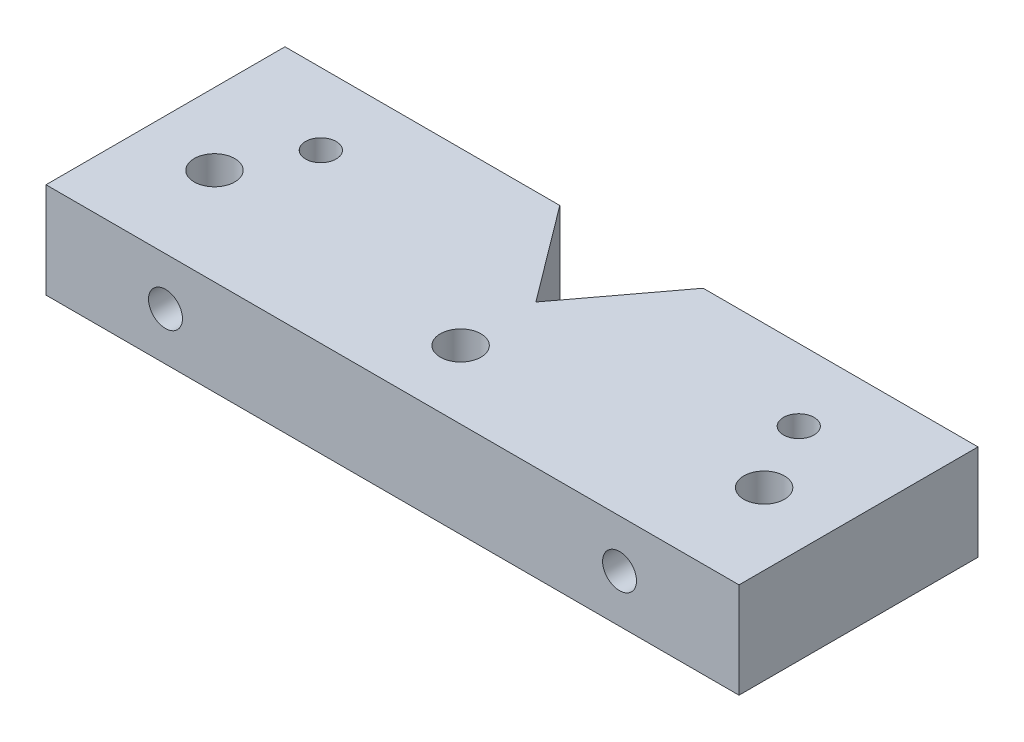
ISO-10303-21;
HEADER;
FILE_DESCRIPTION(('STEP AP214'),'2;1');
FILE_NAME('part.step','',(''),(''),'','','');
FILE_SCHEMA(('AUTOMOTIVE_DESIGN { 1 0 10303 214 1 1 1 1 }'));
ENDSEC;
DATA;
#1=APPLICATION_CONTEXT('core data for automotive mechanical design processes');
#2=APPLICATION_PROTOCOL_DEFINITION('international standard','automotive_design',2000,#1);
#3=PRODUCT_CONTEXT('',#1,'mechanical');
#4=PRODUCT('Part','Part','',(#3));
#5=PRODUCT_RELATED_PRODUCT_CATEGORY('part','',(#4));
#6=PRODUCT_DEFINITION_FORMATION('','',#4);
#7=PRODUCT_DEFINITION_CONTEXT('part definition',#1,'design');
#8=PRODUCT_DEFINITION('design','',#6,#7);
#9=PRODUCT_DEFINITION_SHAPE('','',#8);
#10=(LENGTH_UNIT() NAMED_UNIT(*) SI_UNIT(.MILLI.,.METRE.));
#11=(NAMED_UNIT(*) PLANE_ANGLE_UNIT() SI_UNIT($,.RADIAN.));
#12=(NAMED_UNIT(*) SI_UNIT($,.STERADIAN.) SOLID_ANGLE_UNIT());
#13=UNCERTAINTY_MEASURE_WITH_UNIT(LENGTH_MEASURE(1.E-05),#10,'distance_accuracy_value','');
#14=(GEOMETRIC_REPRESENTATION_CONTEXT(3) GLOBAL_UNCERTAINTY_ASSIGNED_CONTEXT((#13)) GLOBAL_UNIT_ASSIGNED_CONTEXT((#10,
#11,#12)) REPRESENTATION_CONTEXT('',''));
#15=CARTESIAN_POINT('',(0.,0.,0.));
#16=DIRECTION('',(0.,0.,1.));
#17=DIRECTION('',(1.,0.,0.));
#18=AXIS2_PLACEMENT_3D('',#15,#16,#17);
#19=CARTESIAN_POINT('',(0.,20.,0.));
#20=DIRECTION('',(0.,-1.,0.));
#21=DIRECTION('',(0.,0.,-1.));
#22=AXIS2_PLACEMENT_3D('',#19,#20,#21);
#23=PLANE('',#22);
#24=CARTESIAN_POINT('',(22.5,20.,-35.));
#25=DIRECTION('',(0.,1.,0.));
#26=DIRECTION('',(0.,0.,1.));
#27=AXIS2_PLACEMENT_3D('',#24,#25,#26);
#28=CIRCLE('',#27,3.2);
#29=CARTESIAN_POINT('',(22.5,20.,-31.8));
#30=VERTEX_POINT('',#29);
#31=EDGE_CURVE('E198',#30,#30,#28,.T.);
#32=ORIENTED_EDGE('',*,*,#31,.F.);
#33=EDGE_LOOP('',(#32));
#34=FACE_BOUND('',#33,.T.);
#35=CARTESIAN_POINT('',(122.5,20.,-35.));
#36=DIRECTION('',(0.,1.,0.));
#37=DIRECTION('',(0.,0.,1.));
#38=AXIS2_PLACEMENT_3D('',#35,#36,#37);
#39=CIRCLE('',#38,3.20000000000001);
#40=CARTESIAN_POINT('',(122.5,20.,-31.8));
#41=VERTEX_POINT('',#40);
#42=EDGE_CURVE('E192',#41,#41,#39,.T.);
#43=ORIENTED_EDGE('',*,*,#42,.F.);
#44=EDGE_LOOP('',(#43));
#45=FACE_BOUND('',#44,.T.);
#46=DIRECTION('',(1.,0.,0.));
#47=VECTOR('',#46,1.);
#48=CARTESIAN_POINT('',(145.,20.,0.));
#49=LINE('',#48,#47);
#50=CARTESIAN_POINT('',(0.,20.,0.));
#51=VERTEX_POINT('',#50);
#52=CARTESIAN_POINT('',(145.,20.,0.));
#53=VERTEX_POINT('',#52);
#54=EDGE_CURVE('E138',#51,#53,#49,.T.);
#55=ORIENTED_EDGE('',*,*,#54,.T.);
#56=DIRECTION('',(0.,0.,-1.));
#57=VECTOR('',#56,1.);
#58=CARTESIAN_POINT('',(145.,20.,-50.));
#59=LINE('',#58,#57);
#60=CARTESIAN_POINT('',(145.,20.,-50.));
#61=VERTEX_POINT('',#60);
#62=EDGE_CURVE('E91',#53,#61,#59,.T.);
#63=ORIENTED_EDGE('',*,*,#62,.T.);
#64=DIRECTION('',(-1.,0.,0.));
#65=VECTOR('',#64,1.);
#66=CARTESIAN_POINT('',(87.5,20.,-50.));
#67=LINE('',#66,#65);
#68=CARTESIAN_POINT('',(87.5,20.,-50.));
#69=VERTEX_POINT('',#68);
#70=EDGE_CURVE('E150',#61,#69,#67,.T.);
#71=ORIENTED_EDGE('',*,*,#70,.T.);
#72=DIRECTION('',(-0.6,0.,0.8));
#73=VECTOR('',#72,1.);
#74=CARTESIAN_POINT('',(72.5,20.,-30.));
#75=LINE('',#74,#73);
#76=CARTESIAN_POINT('',(72.5,20.,-30.));
#77=VERTEX_POINT('',#76);
#78=EDGE_CURVE('E107',#69,#77,#75,.T.);
#79=ORIENTED_EDGE('',*,*,#78,.T.);
#80=DIRECTION('',(-0.6,0.,-0.8));
#81=VECTOR('',#80,1.);
#82=CARTESIAN_POINT('',(57.5,20.,-50.));
#83=LINE('',#82,#81);
#84=CARTESIAN_POINT('',(57.5,20.,-50.));
#85=VERTEX_POINT('',#84);
#86=EDGE_CURVE('E101',#77,#85,#83,.T.);
#87=ORIENTED_EDGE('',*,*,#86,.T.);
#88=DIRECTION('',(-1.,0.,0.));
#89=VECTOR('',#88,1.);
#90=CARTESIAN_POINT('',(0.,20.,-50.));
#91=LINE('',#90,#89);
#92=CARTESIAN_POINT('',(0.,20.,-50.));
#93=VERTEX_POINT('',#92);
#94=EDGE_CURVE('E105',#85,#93,#91,.T.);
#95=ORIENTED_EDGE('',*,*,#94,.T.);
#96=DIRECTION('',(0.,0.,1.));
#97=VECTOR('',#96,1.);
#98=CARTESIAN_POINT('',(0.,20.,0.));
#99=LINE('',#98,#97);
#100=EDGE_CURVE('E51',#93,#51,#99,.T.);
#101=ORIENTED_EDGE('',*,*,#100,.T.);
#102=EDGE_LOOP('',(#55,#63,#71,#79,#87,#95,#101));
#103=FACE_BOUND('',#102,.T.);
#104=CARTESIAN_POINT('',(15.,20.,-20.25));
#105=DIRECTION('',(0.,1.,0.));
#106=DIRECTION('',(0.,0.,1.));
#107=AXIS2_PLACEMENT_3D('',#104,#105,#106);
#108=CIRCLE('',#107,4.25);
#109=CARTESIAN_POINT('',(15.,20.,-16.));
#110=VERTEX_POINT('',#109);
#111=EDGE_CURVE('E129',#110,#110,#108,.T.);
#112=ORIENTED_EDGE('',*,*,#111,.F.);
#113=EDGE_LOOP('',(#112));
#114=FACE_BOUND('',#113,.T.);
#115=CARTESIAN_POINT('',(72.5,20.,-14.25));
#116=DIRECTION('',(0.,1.,0.));
#117=DIRECTION('',(0.,0.,1.));
#118=AXIS2_PLACEMENT_3D('',#115,#116,#117);
#119=CIRCLE('',#118,4.25000000000001);
#120=CARTESIAN_POINT('',(72.5,20.,-9.99999999999998));
#121=VERTEX_POINT('',#120);
#122=EDGE_CURVE('E165',#121,#121,#119,.T.);
#123=ORIENTED_EDGE('',*,*,#122,.F.);
#124=EDGE_LOOP('',(#123));
#125=FACE_BOUND('',#124,.T.);
#126=CARTESIAN_POINT('',(130.,20.,-20.25));
#127=DIRECTION('',(0.,1.,0.));
#128=DIRECTION('',(0.,0.,1.));
#129=AXIS2_PLACEMENT_3D('',#126,#127,#128);
#130=CIRCLE('',#129,4.25);
#131=CARTESIAN_POINT('',(130.,20.,-16.));
#132=VERTEX_POINT('',#131);
#133=EDGE_CURVE('E171',#132,#132,#130,.T.);
#134=ORIENTED_EDGE('',*,*,#133,.F.);
#135=EDGE_LOOP('',(#134));
#136=FACE_BOUND('',#135,.T.);
#137=ADVANCED_FACE('F34',(#34,#45,#103,#114,#125,#136),#23,.F.);
#138=CARTESIAN_POINT('',(0.,0.,0.));
#139=DIRECTION('',(0.,-1.,0.));
#140=DIRECTION('',(0.,0.,-1.));
#141=AXIS2_PLACEMENT_3D('',#138,#139,#140);
#142=PLANE('',#141);
#143=CARTESIAN_POINT('',(72.5,0.,-14.25));
#144=DIRECTION('',(0.,1.,0.));
#145=DIRECTION('',(0.,0.,1.));
#146=AXIS2_PLACEMENT_3D('',#143,#144,#145);
#147=CIRCLE('',#146,4.25000000000001);
#148=CARTESIAN_POINT('',(72.5,0.,-9.99999999999998));
#149=VERTEX_POINT('',#148);
#150=EDGE_CURVE('E168',#149,#149,#147,.T.);
#151=ORIENTED_EDGE('',*,*,#150,.T.);
#152=EDGE_LOOP('',(#151));
#153=FACE_BOUND('',#152,.T.);
#154=DIRECTION('',(1.,0.,0.));
#155=VECTOR('',#154,1.);
#156=CARTESIAN_POINT('',(145.,0.,0.));
#157=LINE('',#156,#155);
#158=CARTESIAN_POINT('',(0.,0.,0.));
#159=VERTEX_POINT('',#158);
#160=CARTESIAN_POINT('',(145.,0.,0.));
#161=VERTEX_POINT('',#160);
#162=EDGE_CURVE('E125',#159,#161,#157,.T.);
#163=ORIENTED_EDGE('',*,*,#162,.F.);
#164=DIRECTION('',(0.,0.,1.));
#165=VECTOR('',#164,1.);
#166=CARTESIAN_POINT('',(0.,0.,0.));
#167=LINE('',#166,#165);
#168=CARTESIAN_POINT('',(0.,0.,-50.));
#169=VERTEX_POINT('',#168);
#170=EDGE_CURVE('E83',#169,#159,#167,.T.);
#171=ORIENTED_EDGE('',*,*,#170,.F.);
#172=DIRECTION('',(-1.,0.,0.));
#173=VECTOR('',#172,1.);
#174=CARTESIAN_POINT('',(0.,0.,-50.));
#175=LINE('',#174,#173);
#176=CARTESIAN_POINT('',(57.5,0.,-50.));
#177=VERTEX_POINT('',#176);
#178=EDGE_CURVE('E77',#177,#169,#175,.T.);
#179=ORIENTED_EDGE('',*,*,#178,.F.);
#180=DIRECTION('',(-0.6,0.,-0.8));
#181=VECTOR('',#180,1.);
#182=CARTESIAN_POINT('',(57.5,0.,-50.));
#183=LINE('',#182,#181);
#184=CARTESIAN_POINT('',(72.5,0.,-30.));
#185=VERTEX_POINT('',#184);
#186=EDGE_CURVE('E115',#185,#177,#183,.T.);
#187=ORIENTED_EDGE('',*,*,#186,.F.);
#188=DIRECTION('',(-0.6,0.,0.8));
#189=VECTOR('',#188,1.);
#190=CARTESIAN_POINT('',(72.5,0.,-30.));
#191=LINE('',#190,#189);
#192=CARTESIAN_POINT('',(87.5,0.,-50.));
#193=VERTEX_POINT('',#192);
#194=EDGE_CURVE('E133',#193,#185,#191,.T.);
#195=ORIENTED_EDGE('',*,*,#194,.F.);
#196=DIRECTION('',(-1.,0.,0.));
#197=VECTOR('',#196,1.);
#198=CARTESIAN_POINT('',(87.5,0.,-50.));
#199=LINE('',#198,#197);
#200=CARTESIAN_POINT('',(145.,0.,-50.));
#201=VERTEX_POINT('',#200);
#202=EDGE_CURVE('E131',#201,#193,#199,.T.);
#203=ORIENTED_EDGE('',*,*,#202,.F.);
#204=DIRECTION('',(0.,0.,-1.));
#205=VECTOR('',#204,1.);
#206=CARTESIAN_POINT('',(145.,0.,-50.));
#207=LINE('',#206,#205);
#208=EDGE_CURVE('E128',#161,#201,#207,.T.);
#209=ORIENTED_EDGE('',*,*,#208,.F.);
#210=EDGE_LOOP('',(#163,#171,#179,#187,#195,#203,#209));
#211=FACE_BOUND('',#210,.T.);
#212=CARTESIAN_POINT('',(15.,0.,-20.25));
#213=DIRECTION('',(0.,1.,0.));
#214=DIRECTION('',(0.,0.,1.));
#215=AXIS2_PLACEMENT_3D('',#212,#213,#214);
#216=CIRCLE('',#215,4.25);
#217=CARTESIAN_POINT('',(15.,0.,-16.));
#218=VERTEX_POINT('',#217);
#219=EDGE_CURVE('E162',#218,#218,#216,.T.);
#220=ORIENTED_EDGE('',*,*,#219,.T.);
#221=EDGE_LOOP('',(#220));
#222=FACE_BOUND('',#221,.T.);
#223=CARTESIAN_POINT('',(130.,0.,-20.25));
#224=DIRECTION('',(0.,1.,0.));
#225=DIRECTION('',(0.,0.,1.));
#226=AXIS2_PLACEMENT_3D('',#223,#224,#225);
#227=CIRCLE('',#226,4.25);
#228=CARTESIAN_POINT('',(130.,0.,-16.));
#229=VERTEX_POINT('',#228);
#230=EDGE_CURVE('E174',#229,#229,#227,.T.);
#231=ORIENTED_EDGE('',*,*,#230,.T.);
#232=EDGE_LOOP('',(#231));
#233=FACE_BOUND('',#232,.T.);
#234=ADVANCED_FACE('F154',(#153,#211,#222,#233),#142,.T.);
#235=CARTESIAN_POINT('',(145.,20.,0.));
#236=DIRECTION('',(0.,0.,-1.));
#237=DIRECTION('',(-1.,0.,0.));
#238=AXIS2_PLACEMENT_3D('',#235,#236,#237);
#239=PLANE('',#238);
#240=CARTESIAN_POINT('',(25.,10.,0.));
#241=DIRECTION('',(0.,0.,1.));
#242=DIRECTION('',(1.,0.,0.));
#243=AXIS2_PLACEMENT_3D('',#240,#241,#242);
#244=CIRCLE('',#243,3.55);
#245=CARTESIAN_POINT('',(28.55,10.,0.));
#246=VERTEX_POINT('',#245);
#247=EDGE_CURVE('E187',#246,#246,#244,.T.);
#248=ORIENTED_EDGE('',*,*,#247,.F.);
#249=EDGE_LOOP('',(#248));
#250=FACE_BOUND('',#249,.T.);
#251=CARTESIAN_POINT('',(120.,10.,0.));
#252=DIRECTION('',(0.,0.,1.));
#253=DIRECTION('',(1.,0.,0.));
#254=AXIS2_PLACEMENT_3D('',#251,#252,#253);
#255=CIRCLE('',#254,3.55);
#256=CARTESIAN_POINT('',(123.55,10.,0.));
#257=VERTEX_POINT('',#256);
#258=EDGE_CURVE('E180',#257,#257,#255,.T.);
#259=ORIENTED_EDGE('',*,*,#258,.F.);
#260=EDGE_LOOP('',(#259));
#261=FACE_BOUND('',#260,.T.);
#262=ORIENTED_EDGE('',*,*,#162,.T.);
#263=DIRECTION('',(0.,-1.,0.));
#264=VECTOR('',#263,1.);
#265=CARTESIAN_POINT('',(145.,20.,0.));
#266=LINE('',#265,#264);
#267=EDGE_CURVE('E11',#53,#161,#266,.T.);
#268=ORIENTED_EDGE('',*,*,#267,.F.);
#269=ORIENTED_EDGE('',*,*,#54,.F.);
#270=DIRECTION('',(0.,-1.,0.));
#271=VECTOR('',#270,1.);
#272=CARTESIAN_POINT('',(0.,20.,0.));
#273=LINE('',#272,#271);
#274=EDGE_CURVE('E121',#51,#159,#273,.T.);
#275=ORIENTED_EDGE('',*,*,#274,.T.);
#276=EDGE_LOOP('',(#262,#268,#269,#275));
#277=FACE_BOUND('',#276,.T.);
#278=ADVANCED_FACE('F36',(#250,#261,#277),#239,.F.);
#279=CARTESIAN_POINT('',(145.,20.,-50.));
#280=DIRECTION('',(-1.,0.,0.));
#281=DIRECTION('',(0.,0.,1.));
#282=AXIS2_PLACEMENT_3D('',#279,#280,#281);
#283=PLANE('',#282);
#284=ORIENTED_EDGE('',*,*,#208,.T.);
#285=DIRECTION('',(0.,-1.,0.));
#286=VECTOR('',#285,1.);
#287=CARTESIAN_POINT('',(145.,20.,-50.));
#288=LINE('',#287,#286);
#289=EDGE_CURVE('E43',#61,#201,#288,.T.);
#290=ORIENTED_EDGE('',*,*,#289,.F.);
#291=ORIENTED_EDGE('',*,*,#62,.F.);
#292=ORIENTED_EDGE('',*,*,#267,.T.);
#293=EDGE_LOOP('',(#284,#290,#291,#292));
#294=FACE_BOUND('',#293,.T.);
#295=ADVANCED_FACE('F270',(#294),#283,.F.);
#296=CARTESIAN_POINT('',(87.5,20.,-50.));
#297=DIRECTION('',(0.,0.,1.));
#298=DIRECTION('',(1.,0.,0.));
#299=AXIS2_PLACEMENT_3D('',#296,#297,#298);
#300=PLANE('',#299);
#301=ORIENTED_EDGE('',*,*,#202,.T.);
#302=DIRECTION('',(0.,-1.,0.));
#303=VECTOR('',#302,1.);
#304=CARTESIAN_POINT('',(87.5,20.,-50.));
#305=LINE('',#304,#303);
#306=EDGE_CURVE('E142',#69,#193,#305,.T.);
#307=ORIENTED_EDGE('',*,*,#306,.F.);
#308=ORIENTED_EDGE('',*,*,#70,.F.);
#309=ORIENTED_EDGE('',*,*,#289,.T.);
#310=EDGE_LOOP('',(#301,#307,#308,#309));
#311=FACE_BOUND('',#310,.T.);
#312=ADVANCED_FACE('F148',(#311),#300,.F.);
#313=CARTESIAN_POINT('',(72.5,20.,-30.));
#314=DIRECTION('',(0.8,0.,0.6));
#315=DIRECTION('',(0.6,0.,-0.8));
#316=AXIS2_PLACEMENT_3D('',#313,#314,#315);
#317=PLANE('',#316);
#318=ORIENTED_EDGE('',*,*,#194,.T.);
#319=DIRECTION('',(0.,-1.,0.));
#320=VECTOR('',#319,1.);
#321=CARTESIAN_POINT('',(72.5,20.,-30.));
#322=LINE('',#321,#320);
#323=EDGE_CURVE('E116',#77,#185,#322,.T.);
#324=ORIENTED_EDGE('',*,*,#323,.F.);
#325=ORIENTED_EDGE('',*,*,#78,.F.);
#326=ORIENTED_EDGE('',*,*,#306,.T.);
#327=EDGE_LOOP('',(#318,#324,#325,#326));
#328=FACE_BOUND('',#327,.T.);
#329=ADVANCED_FACE('F157',(#328),#317,.F.);
#330=CARTESIAN_POINT('',(57.5,20.,-50.));
#331=DIRECTION('',(-0.8,0.,0.6));
#332=DIRECTION('',(0.6,0.,0.8));
#333=AXIS2_PLACEMENT_3D('',#330,#331,#332);
#334=PLANE('',#333);
#335=ORIENTED_EDGE('',*,*,#186,.T.);
#336=DIRECTION('',(0.,-1.,0.));
#337=VECTOR('',#336,1.);
#338=CARTESIAN_POINT('',(57.5,20.,-50.));
#339=LINE('',#338,#337);
#340=EDGE_CURVE('E112',#85,#177,#339,.T.);
#341=ORIENTED_EDGE('',*,*,#340,.F.);
#342=ORIENTED_EDGE('',*,*,#86,.F.);
#343=ORIENTED_EDGE('',*,*,#323,.T.);
#344=EDGE_LOOP('',(#335,#341,#342,#343));
#345=FACE_BOUND('',#344,.T.);
#346=ADVANCED_FACE('F113',(#345),#334,.F.);
#347=CARTESIAN_POINT('',(0.,20.,-50.));
#348=DIRECTION('',(0.,0.,1.));
#349=DIRECTION('',(1.,0.,0.));
#350=AXIS2_PLACEMENT_3D('',#347,#348,#349);
#351=PLANE('',#350);
#352=ORIENTED_EDGE('',*,*,#178,.T.);
#353=DIRECTION('',(0.,-1.,0.));
#354=VECTOR('',#353,1.);
#355=CARTESIAN_POINT('',(0.,20.,-50.));
#356=LINE('',#355,#354);
#357=EDGE_CURVE('E117',#93,#169,#356,.T.);
#358=ORIENTED_EDGE('',*,*,#357,.F.);
#359=ORIENTED_EDGE('',*,*,#94,.F.);
#360=ORIENTED_EDGE('',*,*,#340,.T.);
#361=EDGE_LOOP('',(#352,#358,#359,#360));
#362=FACE_BOUND('',#361,.T.);
#363=ADVANCED_FACE('F119',(#362),#351,.F.);
#364=CARTESIAN_POINT('',(0.,20.,0.));
#365=DIRECTION('',(1.,0.,0.));
#366=DIRECTION('',(0.,0.,-1.));
#367=AXIS2_PLACEMENT_3D('',#364,#365,#366);
#368=PLANE('',#367);
#369=ORIENTED_EDGE('',*,*,#170,.T.);
#370=ORIENTED_EDGE('',*,*,#274,.F.);
#371=ORIENTED_EDGE('',*,*,#100,.F.);
#372=ORIENTED_EDGE('',*,*,#357,.T.);
#373=EDGE_LOOP('',(#369,#370,#371,#372));
#374=FACE_BOUND('',#373,.T.);
#375=ADVANCED_FACE('F255',(#374),#368,.F.);
#376=CARTESIAN_POINT('',(15.,20.,-20.25));
#377=DIRECTION('',(0.,-1.,0.));
#378=DIRECTION('',(0.,0.,-1.));
#379=AXIS2_PLACEMENT_3D('',#376,#377,#378);
#380=CYLINDRICAL_SURFACE('',#379,4.25);
#381=ORIENTED_EDGE('',*,*,#111,.T.);
#382=EDGE_LOOP('',(#381));
#383=FACE_BOUND('',#382,.T.);
#384=ORIENTED_EDGE('',*,*,#219,.F.);
#385=EDGE_LOOP('',(#384));
#386=FACE_BOUND('',#385,.T.);
#387=ADVANCED_FACE('F252',(#383,#386),#380,.F.);
#388=CARTESIAN_POINT('',(72.5,20.,-14.25));
#389=DIRECTION('',(0.,-1.,0.));
#390=DIRECTION('',(0.,0.,-1.));
#391=AXIS2_PLACEMENT_3D('',#388,#389,#390);
#392=CYLINDRICAL_SURFACE('',#391,4.25000000000001);
#393=ORIENTED_EDGE('',*,*,#122,.T.);
#394=EDGE_LOOP('',(#393));
#395=FACE_BOUND('',#394,.T.);
#396=ORIENTED_EDGE('',*,*,#150,.F.);
#397=EDGE_LOOP('',(#396));
#398=FACE_BOUND('',#397,.T.);
#399=ADVANCED_FACE('F248',(#395,#398),#392,.F.);
#400=CARTESIAN_POINT('',(130.,20.,-20.25));
#401=DIRECTION('',(0.,-1.,0.));
#402=DIRECTION('',(0.,0.,-1.));
#403=AXIS2_PLACEMENT_3D('',#400,#401,#402);
#404=CYLINDRICAL_SURFACE('',#403,4.25);
#405=ORIENTED_EDGE('',*,*,#133,.T.);
#406=EDGE_LOOP('',(#405));
#407=FACE_BOUND('',#406,.T.);
#408=ORIENTED_EDGE('',*,*,#230,.F.);
#409=EDGE_LOOP('',(#408));
#410=FACE_BOUND('',#409,.T.);
#411=ADVANCED_FACE('F244',(#407,#410),#404,.F.);
#412=CARTESIAN_POINT('',(120.,10.,-10.5));
#413=DIRECTION('',(0.,0.,1.));
#414=DIRECTION('',(1.,0.,0.));
#415=AXIS2_PLACEMENT_3D('',#412,#413,#414);
#416=CYLINDRICAL_SURFACE('',#415,3.55);
#417=CARTESIAN_POINT('',(120.,10.,-10.5));
#418=DIRECTION('',(0.,0.,1.));
#419=DIRECTION('',(1.,0.,0.));
#420=AXIS2_PLACEMENT_3D('',#417,#418,#419);
#421=CIRCLE('',#420,3.55);
#422=CARTESIAN_POINT('',(123.55,10.,-10.5));
#423=VERTEX_POINT('',#422);
#424=EDGE_CURVE('E183',#423,#423,#421,.T.);
#425=CARTESIAN_POINT('',(123.55,10.,-10.5));
#426=CARTESIAN_POINT('',(123.55,10.,-10.390625));
#427=CARTESIAN_POINT('',(123.55,10.,-10.28125));
#428=CARTESIAN_POINT('',(123.55,10.,-10.0625));
#429=CARTESIAN_POINT('',(123.55,10.,-9.953125));
#430=CARTESIAN_POINT('',(123.55,10.,-9.734375));
#431=CARTESIAN_POINT('',(123.55,10.,-9.625));
#432=CARTESIAN_POINT('',(123.55,10.,-9.40625));
#433=CARTESIAN_POINT('',(123.55,10.,-9.296875));
#434=CARTESIAN_POINT('',(123.55,10.,-9.078125));
#435=CARTESIAN_POINT('',(123.55,10.,-8.96875));
#436=CARTESIAN_POINT('',(123.55,10.,-8.75));
#437=CARTESIAN_POINT('',(123.55,10.,-8.640625));
#438=CARTESIAN_POINT('',(123.55,10.,-8.421875));
#439=CARTESIAN_POINT('',(123.55,10.,-8.3125));
#440=CARTESIAN_POINT('',(123.55,10.,-8.09375));
#441=CARTESIAN_POINT('',(123.55,10.,-7.984375));
#442=CARTESIAN_POINT('',(123.55,10.,-7.765625));
#443=CARTESIAN_POINT('',(123.55,10.,-7.65625));
#444=CARTESIAN_POINT('',(123.55,10.,-7.4375));
#445=CARTESIAN_POINT('',(123.55,10.,-7.328125));
#446=CARTESIAN_POINT('',(123.55,10.,-7.109375));
#447=CARTESIAN_POINT('',(123.55,10.,-7.));
#448=CARTESIAN_POINT('',(123.55,10.,-6.78125));
#449=CARTESIAN_POINT('',(123.55,10.,-6.671875));
#450=CARTESIAN_POINT('',(123.55,10.,-6.453125));
#451=CARTESIAN_POINT('',(123.55,10.,-6.34375));
#452=CARTESIAN_POINT('',(123.55,10.,-6.125));
#453=CARTESIAN_POINT('',(123.55,10.,-6.015625));
#454=CARTESIAN_POINT('',(123.55,10.,-5.796875));
#455=CARTESIAN_POINT('',(123.55,10.,-5.6875));
#456=CARTESIAN_POINT('',(123.55,10.,-5.46875));
#457=CARTESIAN_POINT('',(123.55,10.,-5.359375));
#458=CARTESIAN_POINT('',(123.55,10.,-5.140625));
#459=CARTESIAN_POINT('',(123.55,10.,-5.03125));
#460=CARTESIAN_POINT('',(123.55,10.,-4.8125));
#461=CARTESIAN_POINT('',(123.55,10.,-4.703125));
#462=CARTESIAN_POINT('',(123.55,10.,-4.484375));
#463=CARTESIAN_POINT('',(123.55,10.,-4.375));
#464=CARTESIAN_POINT('',(123.55,10.,-4.15625));
#465=CARTESIAN_POINT('',(123.55,10.,-4.046875));
#466=CARTESIAN_POINT('',(123.55,10.,-3.828125));
#467=CARTESIAN_POINT('',(123.55,10.,-3.71875));
#468=CARTESIAN_POINT('',(123.55,10.,-3.5));
#469=CARTESIAN_POINT('',(123.55,10.,-3.390625));
#470=CARTESIAN_POINT('',(123.55,10.,-3.171875));
#471=CARTESIAN_POINT('',(123.55,10.,-3.0625));
#472=CARTESIAN_POINT('',(123.55,10.,-2.84375));
#473=CARTESIAN_POINT('',(123.55,10.,-2.734375));
#474=CARTESIAN_POINT('',(123.55,10.,-2.515625));
#475=CARTESIAN_POINT('',(123.55,10.,-2.40625));
#476=CARTESIAN_POINT('',(123.55,10.,-2.1875));
#477=CARTESIAN_POINT('',(123.55,10.,-2.078125));
#478=CARTESIAN_POINT('',(123.55,10.,-1.859375));
#479=CARTESIAN_POINT('',(123.55,10.,-1.75));
#480=CARTESIAN_POINT('',(123.55,10.,-1.53125));
#481=CARTESIAN_POINT('',(123.55,10.,-1.421875));
#482=CARTESIAN_POINT('',(123.55,10.,-1.203125));
#483=CARTESIAN_POINT('',(123.55,10.,-1.09375));
#484=CARTESIAN_POINT('',(123.55,10.,-0.875000000000001));
#485=CARTESIAN_POINT('',(123.55,10.,-0.765625000000001));
#486=CARTESIAN_POINT('',(123.55,10.,-0.546875));
#487=CARTESIAN_POINT('',(123.55,10.,-0.4375));
#488=CARTESIAN_POINT('',(123.55,10.,-0.21875));
#489=CARTESIAN_POINT('',(123.55,10.,-0.109375));
#490=CARTESIAN_POINT('',(123.55,10.,0.));
#491=B_SPLINE_CURVE_WITH_KNOTS('',3,(#425,#426,#427,#428,#429,#430,#431,#432,#433,#434,#435,
#436,#437,#438,#439,#440,#441,#442,#443,#444,#445,#446,#447,#448,#449,#450,#451,#452,#453,#454,
#455,#456,#457,#458,#459,#460,#461,#462,#463,#464,#465,#466,#467,#468,#469,#470,#471,#472,#473,
#474,#475,#476,#477,#478,#479,#480,#481,#482,#483,#484,#485,#486,#487,#488,#489,#490),
.UNSPECIFIED.,.F.,.F.,(4,2,2,2,2,2,2,2,2,2,2,2,2,2,2,2,2,2,2,2,2,2,2,2,2,2,2,2,2,2,2,2,4),(0.,
0.328125,0.656250000000001,0.984375000000001,1.3125,1.640625,1.96875,2.296875,2.625,2.953125,
3.28125,3.609375,3.9375,4.265625,4.59375,4.921875,5.25,5.578125,5.90625,6.234375,6.5625,
6.890625,7.21875,7.546875,7.875,8.203125,8.53125,8.859375,9.1875,9.515625,9.84375,10.171875,
10.5),.UNSPECIFIED.);
#492=EDGE_CURVE('BSEAM240',#423,#257,#491,.T.);
#493=ORIENTED_EDGE('',*,*,#424,.F.);
#494=ORIENTED_EDGE('',*,*,#258,.T.);
#495=ORIENTED_EDGE('',*,*,#492,.T.);
#496=ORIENTED_EDGE('',*,*,#492,.F.);
#497=EDGE_LOOP('',(#493,#495,#494,#496));
#498=FACE_BOUND('',#497,.T.);
#499=ADVANCED_FACE('F240',(#498),#416,.F.);
#500=CARTESIAN_POINT('',(120.,10.,-10.5));
#501=DIRECTION('',(0.,0.,1.));
#502=DIRECTION('',(1.,0.,0.));
#503=AXIS2_PLACEMENT_3D('',#500,#501,#502);
#504=PLANE('',#503);
#505=ORIENTED_EDGE('',*,*,#424,.T.);
#506=EDGE_LOOP('',(#505));
#507=FACE_BOUND('',#506,.T.);
#508=ADVANCED_FACE('F236',(#507),#504,.T.);
#509=CARTESIAN_POINT('',(25.,10.,-10.5));
#510=DIRECTION('',(0.,0.,1.));
#511=DIRECTION('',(1.,0.,0.));
#512=AXIS2_PLACEMENT_3D('',#509,#510,#511);
#513=CYLINDRICAL_SURFACE('',#512,3.55);
#514=CARTESIAN_POINT('',(25.,10.,-10.5));
#515=DIRECTION('',(0.,0.,1.));
#516=DIRECTION('',(1.,0.,0.));
#517=AXIS2_PLACEMENT_3D('',#514,#515,#516);
#518=CIRCLE('',#517,3.55);
#519=CARTESIAN_POINT('',(28.55,10.,-10.5));
#520=VERTEX_POINT('',#519);
#521=EDGE_CURVE('E177',#520,#520,#518,.T.);
#522=CARTESIAN_POINT('',(28.55,10.,-10.5));
#523=CARTESIAN_POINT('',(28.55,10.,-10.390625));
#524=CARTESIAN_POINT('',(28.55,10.,-10.28125));
#525=CARTESIAN_POINT('',(28.55,10.,-10.0625));
#526=CARTESIAN_POINT('',(28.55,10.,-9.953125));
#527=CARTESIAN_POINT('',(28.55,10.,-9.734375));
#528=CARTESIAN_POINT('',(28.55,10.,-9.625));
#529=CARTESIAN_POINT('',(28.55,10.,-9.40625));
#530=CARTESIAN_POINT('',(28.55,10.,-9.296875));
#531=CARTESIAN_POINT('',(28.55,10.,-9.078125));
#532=CARTESIAN_POINT('',(28.55,10.,-8.96875));
#533=CARTESIAN_POINT('',(28.55,10.,-8.75));
#534=CARTESIAN_POINT('',(28.55,10.,-8.640625));
#535=CARTESIAN_POINT('',(28.55,10.,-8.421875));
#536=CARTESIAN_POINT('',(28.55,10.,-8.3125));
#537=CARTESIAN_POINT('',(28.55,10.,-8.09375));
#538=CARTESIAN_POINT('',(28.55,10.,-7.984375));
#539=CARTESIAN_POINT('',(28.55,10.,-7.765625));
#540=CARTESIAN_POINT('',(28.55,10.,-7.65625));
#541=CARTESIAN_POINT('',(28.55,10.,-7.4375));
#542=CARTESIAN_POINT('',(28.55,10.,-7.328125));
#543=CARTESIAN_POINT('',(28.55,10.,-7.109375));
#544=CARTESIAN_POINT('',(28.55,10.,-7.));
#545=CARTESIAN_POINT('',(28.55,10.,-6.78125));
#546=CARTESIAN_POINT('',(28.55,10.,-6.671875));
#547=CARTESIAN_POINT('',(28.55,10.,-6.453125));
#548=CARTESIAN_POINT('',(28.55,10.,-6.34375));
#549=CARTESIAN_POINT('',(28.55,10.,-6.125));
#550=CARTESIAN_POINT('',(28.55,10.,-6.015625));
#551=CARTESIAN_POINT('',(28.55,10.,-5.796875));
#552=CARTESIAN_POINT('',(28.55,10.,-5.6875));
#553=CARTESIAN_POINT('',(28.55,10.,-5.46875));
#554=CARTESIAN_POINT('',(28.55,10.,-5.359375));
#555=CARTESIAN_POINT('',(28.55,10.,-5.140625));
#556=CARTESIAN_POINT('',(28.55,10.,-5.03125));
#557=CARTESIAN_POINT('',(28.55,10.,-4.8125));
#558=CARTESIAN_POINT('',(28.55,10.,-4.703125));
#559=CARTESIAN_POINT('',(28.55,10.,-4.484375));
#560=CARTESIAN_POINT('',(28.55,10.,-4.375));
#561=CARTESIAN_POINT('',(28.55,10.,-4.15625));
#562=CARTESIAN_POINT('',(28.55,10.,-4.046875));
#563=CARTESIAN_POINT('',(28.55,10.,-3.828125));
#564=CARTESIAN_POINT('',(28.55,10.,-3.71875));
#565=CARTESIAN_POINT('',(28.55,10.,-3.5));
#566=CARTESIAN_POINT('',(28.55,10.,-3.390625));
#567=CARTESIAN_POINT('',(28.55,10.,-3.171875));
#568=CARTESIAN_POINT('',(28.55,10.,-3.0625));
#569=CARTESIAN_POINT('',(28.55,10.,-2.84375));
#570=CARTESIAN_POINT('',(28.55,10.,-2.734375));
#571=CARTESIAN_POINT('',(28.55,10.,-2.515625));
#572=CARTESIAN_POINT('',(28.55,10.,-2.40625));
#573=CARTESIAN_POINT('',(28.55,10.,-2.1875));
#574=CARTESIAN_POINT('',(28.55,10.,-2.078125));
#575=CARTESIAN_POINT('',(28.55,10.,-1.859375));
#576=CARTESIAN_POINT('',(28.55,10.,-1.75));
#577=CARTESIAN_POINT('',(28.55,10.,-1.53125));
#578=CARTESIAN_POINT('',(28.55,10.,-1.421875));
#579=CARTESIAN_POINT('',(28.55,10.,-1.203125));
#580=CARTESIAN_POINT('',(28.55,10.,-1.09375));
#581=CARTESIAN_POINT('',(28.55,10.,-0.875000000000001));
#582=CARTESIAN_POINT('',(28.55,10.,-0.765625000000001));
#583=CARTESIAN_POINT('',(28.55,10.,-0.546875));
#584=CARTESIAN_POINT('',(28.55,10.,-0.4375));
#585=CARTESIAN_POINT('',(28.55,10.,-0.21875));
#586=CARTESIAN_POINT('',(28.55,10.,-0.109375));
#587=CARTESIAN_POINT('',(28.55,10.,0.));
#588=B_SPLINE_CURVE_WITH_KNOTS('',3,(#522,#523,#524,#525,#526,#527,#528,#529,#530,#531,#532,
#533,#534,#535,#536,#537,#538,#539,#540,#541,#542,#543,#544,#545,#546,#547,#548,#549,#550,#551,
#552,#553,#554,#555,#556,#557,#558,#559,#560,#561,#562,#563,#564,#565,#566,#567,#568,#569,#570,
#571,#572,#573,#574,#575,#576,#577,#578,#579,#580,#581,#582,#583,#584,#585,#586,#587),
.UNSPECIFIED.,.F.,.F.,(4,2,2,2,2,2,2,2,2,2,2,2,2,2,2,2,2,2,2,2,2,2,2,2,2,2,2,2,2,2,2,2,4),(0.,
0.328125,0.656250000000001,0.984375000000001,1.3125,1.640625,1.96875,2.296875,2.625,2.953125,
3.28125,3.609375,3.9375,4.265625,4.59375,4.921875,5.25,5.578125,5.90625,6.234375,6.5625,
6.890625,7.21875,7.546875,7.875,8.203125,8.53125,8.859375,9.1875,9.515625,9.84375,10.171875,
10.5),.UNSPECIFIED.);
#589=EDGE_CURVE('BSEAM229',#520,#246,#588,.T.);
#590=ORIENTED_EDGE('',*,*,#521,.F.);
#591=ORIENTED_EDGE('',*,*,#247,.T.);
#592=ORIENTED_EDGE('',*,*,#589,.T.);
#593=ORIENTED_EDGE('',*,*,#589,.F.);
#594=EDGE_LOOP('',(#590,#592,#591,#593));
#595=FACE_BOUND('',#594,.T.);
#596=ADVANCED_FACE('F229',(#595),#513,.F.);
#597=CARTESIAN_POINT('',(25.,10.,-10.5));
#598=DIRECTION('',(0.,0.,1.));
#599=DIRECTION('',(1.,0.,0.));
#600=AXIS2_PLACEMENT_3D('',#597,#598,#599);
#601=PLANE('',#600);
#602=ORIENTED_EDGE('',*,*,#521,.T.);
#603=EDGE_LOOP('',(#602));
#604=FACE_BOUND('',#603,.T.);
#605=ADVANCED_FACE('F220',(#604),#601,.T.);
#606=CARTESIAN_POINT('',(122.5,9.5,-35.));
#607=DIRECTION('',(0.,1.,0.));
#608=DIRECTION('',(0.,0.,1.));
#609=AXIS2_PLACEMENT_3D('',#606,#607,#608);
#610=CYLINDRICAL_SURFACE('',#609,3.20000000000001);
#611=CARTESIAN_POINT('',(122.5,9.5,-35.));
#612=DIRECTION('',(0.,1.,0.));
#613=DIRECTION('',(0.,0.,1.));
#614=AXIS2_PLACEMENT_3D('',#611,#612,#613);
#615=CIRCLE('',#614,3.20000000000001);
#616=CARTESIAN_POINT('',(122.5,9.5,-31.8));
#617=VERTEX_POINT('',#616);
#618=EDGE_CURVE('E195',#617,#617,#615,.T.);
#619=CARTESIAN_POINT('',(122.5,9.5,-31.8));
#620=CARTESIAN_POINT('',(122.5,9.609375,-31.8));
#621=CARTESIAN_POINT('',(122.5,9.71875,-31.8));
#622=CARTESIAN_POINT('',(122.5,9.9375,-31.8));
#623=CARTESIAN_POINT('',(122.5,10.046875,-31.8));
#624=CARTESIAN_POINT('',(122.5,10.265625,-31.8));
#625=CARTESIAN_POINT('',(122.5,10.375,-31.8));
#626=CARTESIAN_POINT('',(122.5,10.59375,-31.8));
#627=CARTESIAN_POINT('',(122.5,10.703125,-31.8));
#628=CARTESIAN_POINT('',(122.5,10.921875,-31.8));
#629=CARTESIAN_POINT('',(122.5,11.03125,-31.8));
#630=CARTESIAN_POINT('',(122.5,11.25,-31.8));
#631=CARTESIAN_POINT('',(122.5,11.359375,-31.8));
#632=CARTESIAN_POINT('',(122.5,11.578125,-31.8));
#633=CARTESIAN_POINT('',(122.5,11.6875,-31.8));
#634=CARTESIAN_POINT('',(122.5,11.90625,-31.8));
#635=CARTESIAN_POINT('',(122.5,12.015625,-31.8));
#636=CARTESIAN_POINT('',(122.5,12.234375,-31.8));
#637=CARTESIAN_POINT('',(122.5,12.34375,-31.8));
#638=CARTESIAN_POINT('',(122.5,12.5625,-31.8));
#639=CARTESIAN_POINT('',(122.5,12.671875,-31.8));
#640=CARTESIAN_POINT('',(122.5,12.890625,-31.8));
#641=CARTESIAN_POINT('',(122.5,13.,-31.8));
#642=CARTESIAN_POINT('',(122.5,13.21875,-31.8));
#643=CARTESIAN_POINT('',(122.5,13.328125,-31.8));
#644=CARTESIAN_POINT('',(122.5,13.546875,-31.8));
#645=CARTESIAN_POINT('',(122.5,13.65625,-31.8));
#646=CARTESIAN_POINT('',(122.5,13.875,-31.8));
#647=CARTESIAN_POINT('',(122.5,13.984375,-31.8));
#648=CARTESIAN_POINT('',(122.5,14.203125,-31.8));
#649=CARTESIAN_POINT('',(122.5,14.3125,-31.8));
#650=CARTESIAN_POINT('',(122.5,14.53125,-31.8));
#651=CARTESIAN_POINT('',(122.5,14.640625,-31.8));
#652=CARTESIAN_POINT('',(122.5,14.859375,-31.8));
#653=CARTESIAN_POINT('',(122.5,14.96875,-31.8));
#654=CARTESIAN_POINT('',(122.5,15.1875,-31.8));
#655=CARTESIAN_POINT('',(122.5,15.296875,-31.8));
#656=CARTESIAN_POINT('',(122.5,15.515625,-31.8));
#657=CARTESIAN_POINT('',(122.5,15.625,-31.8));
#658=CARTESIAN_POINT('',(122.5,15.84375,-31.8));
#659=CARTESIAN_POINT('',(122.5,15.953125,-31.8));
#660=CARTESIAN_POINT('',(122.5,16.171875,-31.8));
#661=CARTESIAN_POINT('',(122.5,16.28125,-31.8));
#662=CARTESIAN_POINT('',(122.5,16.5,-31.8));
#663=CARTESIAN_POINT('',(122.5,16.609375,-31.8));
#664=CARTESIAN_POINT('',(122.5,16.828125,-31.8));
#665=CARTESIAN_POINT('',(122.5,16.9375,-31.8));
#666=CARTESIAN_POINT('',(122.5,17.15625,-31.8));
#667=CARTESIAN_POINT('',(122.5,17.265625,-31.8));
#668=CARTESIAN_POINT('',(122.5,17.484375,-31.8));
#669=CARTESIAN_POINT('',(122.5,17.59375,-31.8));
#670=CARTESIAN_POINT('',(122.5,17.8125,-31.8));
#671=CARTESIAN_POINT('',(122.5,17.921875,-31.8));
#672=CARTESIAN_POINT('',(122.5,18.140625,-31.8));
#673=CARTESIAN_POINT('',(122.5,18.25,-31.8));
#674=CARTESIAN_POINT('',(122.5,18.46875,-31.8));
#675=CARTESIAN_POINT('',(122.5,18.578125,-31.8));
#676=CARTESIAN_POINT('',(122.5,18.796875,-31.8));
#677=CARTESIAN_POINT('',(122.5,18.90625,-31.8));
#678=CARTESIAN_POINT('',(122.5,19.125,-31.8));
#679=CARTESIAN_POINT('',(122.5,19.234375,-31.8));
#680=CARTESIAN_POINT('',(122.5,19.453125,-31.8));
#681=CARTESIAN_POINT('',(122.5,19.5625,-31.8));
#682=CARTESIAN_POINT('',(122.5,19.78125,-31.8));
#683=CARTESIAN_POINT('',(122.5,19.890625,-31.8));
#684=CARTESIAN_POINT('',(122.5,20.,-31.8));
#685=B_SPLINE_CURVE_WITH_KNOTS('',3,(#619,#620,#621,#622,#623,#624,#625,#626,#627,#628,#629,
#630,#631,#632,#633,#634,#635,#636,#637,#638,#639,#640,#641,#642,#643,#644,#645,#646,#647,#648,
#649,#650,#651,#652,#653,#654,#655,#656,#657,#658,#659,#660,#661,#662,#663,#664,#665,#666,#667,
#668,#669,#670,#671,#672,#673,#674,#675,#676,#677,#678,#679,#680,#681,#682,#683,#684),
.UNSPECIFIED.,.F.,.F.,(4,2,2,2,2,2,2,2,2,2,2,2,2,2,2,2,2,2,2,2,2,2,2,2,2,2,2,2,2,2,2,2,4),(0.,
0.328125,0.656250000000001,0.984375000000001,1.3125,1.640625,1.96875,2.296875,2.625,2.953125,
3.28125,3.609375,3.9375,4.265625,4.59375,4.921875,5.25,5.578125,5.90625,6.234375,6.5625,
6.890625,7.21875,7.54687500000001,7.875,8.203125,8.53125,8.859375,9.1875,9.515625,9.84375,
10.171875,10.5),.UNSPECIFIED.);
#686=EDGE_CURVE('BSEAM218',#617,#41,#685,.T.);
#687=ORIENTED_EDGE('',*,*,#618,.F.);
#688=ORIENTED_EDGE('',*,*,#42,.T.);
#689=ORIENTED_EDGE('',*,*,#686,.T.);
#690=ORIENTED_EDGE('',*,*,#686,.F.);
#691=EDGE_LOOP('',(#687,#689,#688,#690));
#692=FACE_BOUND('',#691,.T.);
#693=ADVANCED_FACE('F218',(#692),#610,.F.);
#694=CARTESIAN_POINT('',(122.5,9.5,-35.));
#695=DIRECTION('',(0.,1.,0.));
#696=DIRECTION('',(0.,0.,1.));
#697=AXIS2_PLACEMENT_3D('',#694,#695,#696);
#698=PLANE('',#697);
#699=ORIENTED_EDGE('',*,*,#618,.T.);
#700=EDGE_LOOP('',(#699));
#701=FACE_BOUND('',#700,.T.);
#702=ADVANCED_FACE('F209',(#701),#698,.T.);
#703=CARTESIAN_POINT('',(22.5,9.5,-35.));
#704=DIRECTION('',(0.,1.,0.));
#705=DIRECTION('',(0.,0.,1.));
#706=AXIS2_PLACEMENT_3D('',#703,#704,#705);
#707=CYLINDRICAL_SURFACE('',#706,3.2);
#708=CARTESIAN_POINT('',(22.5,9.5,-35.));
#709=DIRECTION('',(0.,1.,0.));
#710=DIRECTION('',(0.,0.,1.));
#711=AXIS2_PLACEMENT_3D('',#708,#709,#710);
#712=CIRCLE('',#711,3.2);
#713=CARTESIAN_POINT('',(22.5,9.5,-31.8));
#714=VERTEX_POINT('',#713);
#715=EDGE_CURVE('E184',#714,#714,#712,.T.);
#716=CARTESIAN_POINT('',(22.5,9.5,-31.8));
#717=CARTESIAN_POINT('',(22.5,9.609375,-31.8));
#718=CARTESIAN_POINT('',(22.5,9.71875,-31.8));
#719=CARTESIAN_POINT('',(22.5,9.9375,-31.8));
#720=CARTESIAN_POINT('',(22.5,10.046875,-31.8));
#721=CARTESIAN_POINT('',(22.5,10.265625,-31.8));
#722=CARTESIAN_POINT('',(22.5,10.375,-31.8));
#723=CARTESIAN_POINT('',(22.5,10.59375,-31.8));
#724=CARTESIAN_POINT('',(22.5,10.703125,-31.8));
#725=CARTESIAN_POINT('',(22.5,10.921875,-31.8));
#726=CARTESIAN_POINT('',(22.5,11.03125,-31.8));
#727=CARTESIAN_POINT('',(22.5,11.25,-31.8));
#728=CARTESIAN_POINT('',(22.5,11.359375,-31.8));
#729=CARTESIAN_POINT('',(22.5,11.578125,-31.8));
#730=CARTESIAN_POINT('',(22.5,11.6875,-31.8));
#731=CARTESIAN_POINT('',(22.5,11.90625,-31.8));
#732=CARTESIAN_POINT('',(22.5,12.015625,-31.8));
#733=CARTESIAN_POINT('',(22.5,12.234375,-31.8));
#734=CARTESIAN_POINT('',(22.5,12.34375,-31.8));
#735=CARTESIAN_POINT('',(22.5,12.5625,-31.8));
#736=CARTESIAN_POINT('',(22.5,12.671875,-31.8));
#737=CARTESIAN_POINT('',(22.5,12.890625,-31.8));
#738=CARTESIAN_POINT('',(22.5,13.,-31.8));
#739=CARTESIAN_POINT('',(22.5,13.21875,-31.8));
#740=CARTESIAN_POINT('',(22.5,13.328125,-31.8));
#741=CARTESIAN_POINT('',(22.5,13.546875,-31.8));
#742=CARTESIAN_POINT('',(22.5,13.65625,-31.8));
#743=CARTESIAN_POINT('',(22.5,13.875,-31.8));
#744=CARTESIAN_POINT('',(22.5,13.984375,-31.8));
#745=CARTESIAN_POINT('',(22.5,14.203125,-31.8));
#746=CARTESIAN_POINT('',(22.5,14.3125,-31.8));
#747=CARTESIAN_POINT('',(22.5,14.53125,-31.8));
#748=CARTESIAN_POINT('',(22.5,14.640625,-31.8));
#749=CARTESIAN_POINT('',(22.5,14.859375,-31.8));
#750=CARTESIAN_POINT('',(22.5,14.96875,-31.8));
#751=CARTESIAN_POINT('',(22.5,15.1875,-31.8));
#752=CARTESIAN_POINT('',(22.5,15.296875,-31.8));
#753=CARTESIAN_POINT('',(22.5,15.515625,-31.8));
#754=CARTESIAN_POINT('',(22.5,15.625,-31.8));
#755=CARTESIAN_POINT('',(22.5,15.84375,-31.8));
#756=CARTESIAN_POINT('',(22.5,15.953125,-31.8));
#757=CARTESIAN_POINT('',(22.5,16.171875,-31.8));
#758=CARTESIAN_POINT('',(22.5,16.28125,-31.8));
#759=CARTESIAN_POINT('',(22.5,16.5,-31.8));
#760=CARTESIAN_POINT('',(22.5,16.609375,-31.8));
#761=CARTESIAN_POINT('',(22.5,16.828125,-31.8));
#762=CARTESIAN_POINT('',(22.5,16.9375,-31.8));
#763=CARTESIAN_POINT('',(22.5,17.15625,-31.8));
#764=CARTESIAN_POINT('',(22.5,17.265625,-31.8));
#765=CARTESIAN_POINT('',(22.5,17.484375,-31.8));
#766=CARTESIAN_POINT('',(22.5,17.59375,-31.8));
#767=CARTESIAN_POINT('',(22.5,17.8125,-31.8));
#768=CARTESIAN_POINT('',(22.5,17.921875,-31.8));
#769=CARTESIAN_POINT('',(22.5,18.140625,-31.8));
#770=CARTESIAN_POINT('',(22.5,18.25,-31.8));
#771=CARTESIAN_POINT('',(22.5,18.46875,-31.8));
#772=CARTESIAN_POINT('',(22.5,18.578125,-31.8));
#773=CARTESIAN_POINT('',(22.5,18.796875,-31.8));
#774=CARTESIAN_POINT('',(22.5,18.90625,-31.8));
#775=CARTESIAN_POINT('',(22.5,19.125,-31.8));
#776=CARTESIAN_POINT('',(22.5,19.234375,-31.8));
#777=CARTESIAN_POINT('',(22.5,19.453125,-31.8));
#778=CARTESIAN_POINT('',(22.5,19.5625,-31.8));
#779=CARTESIAN_POINT('',(22.5,19.78125,-31.8));
#780=CARTESIAN_POINT('',(22.5,19.890625,-31.8));
#781=CARTESIAN_POINT('',(22.5,20.,-31.8));
#782=B_SPLINE_CURVE_WITH_KNOTS('',3,(#716,#717,#718,#719,#720,#721,#722,#723,#724,#725,#726,
#727,#728,#729,#730,#731,#732,#733,#734,#735,#736,#737,#738,#739,#740,#741,#742,#743,#744,#745,
#746,#747,#748,#749,#750,#751,#752,#753,#754,#755,#756,#757,#758,#759,#760,#761,#762,#763,#764,
#765,#766,#767,#768,#769,#770,#771,#772,#773,#774,#775,#776,#777,#778,#779,#780,#781),
.UNSPECIFIED.,.F.,.F.,(4,2,2,2,2,2,2,2,2,2,2,2,2,2,2,2,2,2,2,2,2,2,2,2,2,2,2,2,2,2,2,2,4),(0.,
0.328125,0.656250000000001,0.984375000000001,1.3125,1.640625,1.96875,2.296875,2.625,2.953125,
3.28125,3.609375,3.9375,4.265625,4.59375,4.921875,5.25,5.578125,5.90625,6.234375,6.5625,
6.890625,7.21875,7.54687500000001,7.875,8.203125,8.53125,8.859375,9.1875,9.515625,9.84375,
10.171875,10.5),.UNSPECIFIED.);
#783=EDGE_CURVE('BSEAM206',#714,#30,#782,.T.);
#784=ORIENTED_EDGE('',*,*,#715,.F.);
#785=ORIENTED_EDGE('',*,*,#31,.T.);
#786=ORIENTED_EDGE('',*,*,#783,.T.);
#787=ORIENTED_EDGE('',*,*,#783,.F.);
#788=EDGE_LOOP('',(#784,#786,#785,#787));
#789=FACE_BOUND('',#788,.T.);
#790=ADVANCED_FACE('F206',(#789),#707,.F.);
#791=CARTESIAN_POINT('',(22.5,9.5,-35.));
#792=DIRECTION('',(0.,1.,0.));
#793=DIRECTION('',(0.,0.,1.));
#794=AXIS2_PLACEMENT_3D('',#791,#792,#793);
#795=PLANE('',#794);
#796=ORIENTED_EDGE('',*,*,#715,.T.);
#797=EDGE_LOOP('',(#796));
#798=FACE_BOUND('',#797,.T.);
#799=ADVANCED_FACE('F204',(#798),#795,.T.);
#800=CLOSED_SHELL('',(#137,#234,#278,#295,#312,#329,#346,#363,#375,#387,#399,#411,#499,#508,
#596,#605,#693,#702,#790,#799));
#801=MANIFOLD_SOLID_BREP('B2',#800);
#802=ADVANCED_BREP_SHAPE_REPRESENTATION('',(#18,#801),#14);
#803=SHAPE_DEFINITION_REPRESENTATION(#9,#802);
ENDSEC;
END-ISO-10303-21;
